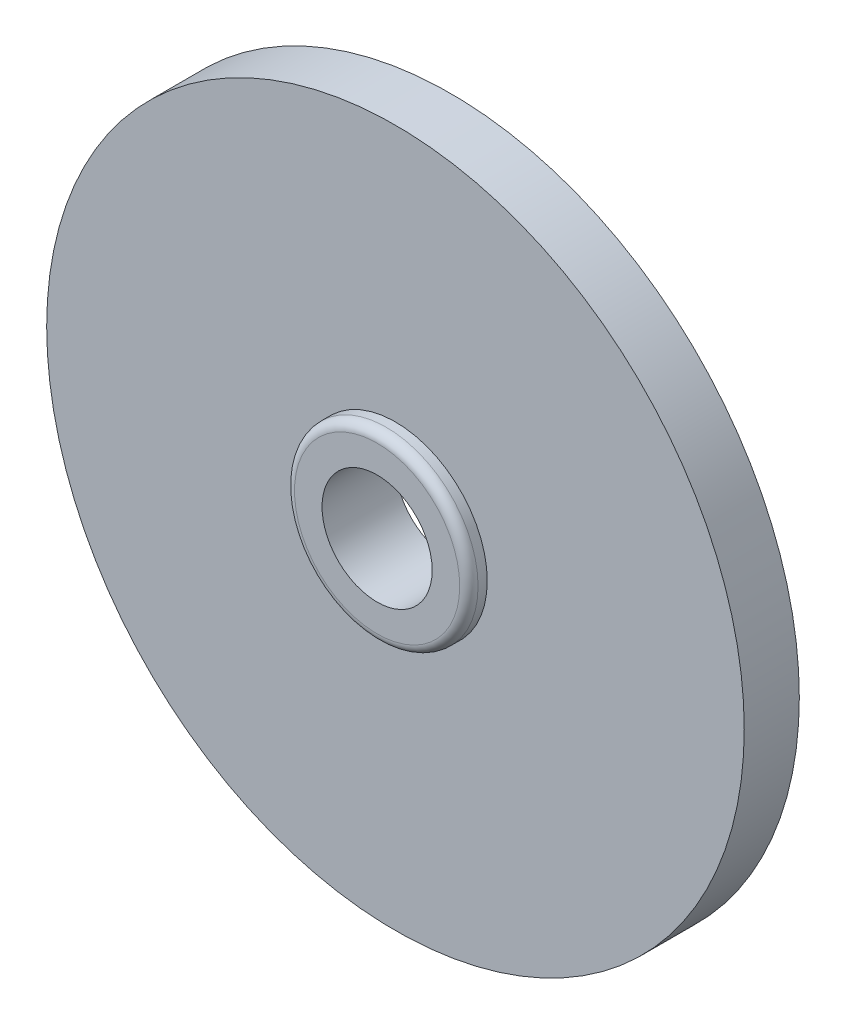
ISO-10303-21;
HEADER;
FILE_DESCRIPTION(('STEP AP214'),'2;1');
FILE_NAME('part.step','',(''),(''),'','','');
FILE_SCHEMA(('AUTOMOTIVE_DESIGN { 1 0 10303 214 1 1 1 1 }'));
ENDSEC;
DATA;
#1=APPLICATION_CONTEXT('core data for automotive mechanical design processes');
#2=APPLICATION_PROTOCOL_DEFINITION('international standard','automotive_design',2000,#1);
#3=PRODUCT_CONTEXT('',#1,'mechanical');
#4=PRODUCT('Part','Part','',(#3));
#5=PRODUCT_RELATED_PRODUCT_CATEGORY('part','',(#4));
#6=PRODUCT_DEFINITION_FORMATION('','',#4);
#7=PRODUCT_DEFINITION_CONTEXT('part definition',#1,'design');
#8=PRODUCT_DEFINITION('design','',#6,#7);
#9=PRODUCT_DEFINITION_SHAPE('','',#8);
#10=(LENGTH_UNIT() NAMED_UNIT(*) SI_UNIT(.MILLI.,.METRE.));
#11=(NAMED_UNIT(*) PLANE_ANGLE_UNIT() SI_UNIT($,.RADIAN.));
#12=(NAMED_UNIT(*) SI_UNIT($,.STERADIAN.) SOLID_ANGLE_UNIT());
#13=UNCERTAINTY_MEASURE_WITH_UNIT(LENGTH_MEASURE(1.E-05),#10,'distance_accuracy_value','');
#14=(GEOMETRIC_REPRESENTATION_CONTEXT(3) GLOBAL_UNCERTAINTY_ASSIGNED_CONTEXT((#13)) GLOBAL_UNIT_ASSIGNED_CONTEXT((#10,
#11,#12)) REPRESENTATION_CONTEXT('',''));
#15=CARTESIAN_POINT('',(0.,0.,0.));
#16=DIRECTION('',(0.,0.,1.));
#17=DIRECTION('',(1.,0.,0.));
#18=AXIS2_PLACEMENT_3D('',#15,#16,#17);
#19=CARTESIAN_POINT('',(0.,0.,1.5));
#20=DIRECTION('',(0.,0.,1.));
#21=DIRECTION('',(1.,0.,0.));
#22=AXIS2_PLACEMENT_3D('',#19,#20,#21);
#23=PLANE('',#22);
#24=CARTESIAN_POINT('',(0.,0.,1.5));
#25=DIRECTION('',(0.,0.,1.));
#26=DIRECTION('',(1.,0.,0.));
#27=AXIS2_PLACEMENT_3D('',#24,#25,#26);
#28=CIRCLE('',#27,9.5);
#29=CARTESIAN_POINT('',(9.5,0.,1.5));
#30=VERTEX_POINT('',#29);
#31=EDGE_CURVE('E42',#30,#30,#28,.T.);
#32=ORIENTED_EDGE('',*,*,#31,.T.);
#33=EDGE_LOOP('',(#32));
#34=FACE_BOUND('',#33,.T.);
#35=CARTESIAN_POINT('',(0.,0.,1.5));
#36=DIRECTION('',(0.,0.,1.));
#37=DIRECTION('',(1.,0.,0.));
#38=AXIS2_PLACEMENT_3D('',#35,#36,#37);
#39=CIRCLE('',#38,2.5);
#40=CARTESIAN_POINT('',(2.5,0.,1.5));
#41=VERTEX_POINT('',#40);
#42=EDGE_CURVE('E50',#41,#41,#39,.T.);
#43=ORIENTED_EDGE('',*,*,#42,.F.);
#44=EDGE_LOOP('',(#43));
#45=FACE_BOUND('',#44,.T.);
#46=ADVANCED_FACE('F31',(#34,#45),#23,.T.);
#47=CARTESIAN_POINT('',(0.,0.,1.5));
#48=DIRECTION('',(0.,0.,-1.));
#49=DIRECTION('',(-1.,0.,0.));
#50=AXIS2_PLACEMENT_3D('',#47,#48,#49);
#51=CYLINDRICAL_SURFACE('',#50,9.5);
#52=ORIENTED_EDGE('',*,*,#31,.F.);
#53=EDGE_LOOP('',(#52));
#54=FACE_BOUND('',#53,.T.);
#55=CARTESIAN_POINT('',(0.,0.,0.));
#56=DIRECTION('',(0.,0.,1.));
#57=DIRECTION('',(1.,0.,0.));
#58=AXIS2_PLACEMENT_3D('',#55,#56,#57);
#59=CIRCLE('',#58,9.5);
#60=CARTESIAN_POINT('',(9.5,0.,0.));
#61=VERTEX_POINT('',#60);
#62=EDGE_CURVE('E46',#61,#61,#59,.T.);
#63=ORIENTED_EDGE('',*,*,#62,.T.);
#64=EDGE_LOOP('',(#63));
#65=FACE_BOUND('',#64,.T.);
#66=ADVANCED_FACE('F76',(#54,#65),#51,.T.);
#67=CARTESIAN_POINT('',(0.,0.,0.));
#68=DIRECTION('',(0.,0.,1.));
#69=DIRECTION('',(1.,0.,0.));
#70=AXIS2_PLACEMENT_3D('',#67,#68,#69);
#71=PLANE('',#70);
#72=CARTESIAN_POINT('',(0.,0.,0.));
#73=DIRECTION('',(0.,0.,1.));
#74=DIRECTION('',(1.,0.,0.));
#75=AXIS2_PLACEMENT_3D('',#72,#73,#74);
#76=CIRCLE('',#75,1.5);
#77=CARTESIAN_POINT('',(1.5,0.,0.));
#78=VERTEX_POINT('',#77);
#79=EDGE_CURVE('E54',#78,#78,#76,.T.);
#80=ORIENTED_EDGE('',*,*,#79,.T.);
#81=EDGE_LOOP('',(#80));
#82=FACE_BOUND('',#81,.T.);
#83=ORIENTED_EDGE('',*,*,#62,.F.);
#84=EDGE_LOOP('',(#83));
#85=FACE_BOUND('',#84,.T.);
#86=ADVANCED_FACE('F73',(#82,#85),#71,.F.);
#87=CARTESIAN_POINT('',(0.,0.,2.));
#88=DIRECTION('',(0.,0.,-1.));
#89=DIRECTION('',(-1.,0.,0.));
#90=AXIS2_PLACEMENT_3D('',#87,#88,#89);
#91=CYLINDRICAL_SURFACE('',#90,2.5);
#92=CARTESIAN_POINT('',(0.,0.,1.75));
#93=DIRECTION('',(0.,0.,1.));
#94=DIRECTION('',(1.,0.,0.));
#95=AXIS2_PLACEMENT_3D('',#92,#93,#94);
#96=CIRCLE('',#95,2.5);
#97=CARTESIAN_POINT('',(2.5,0.,1.75));
#98=VERTEX_POINT('',#97);
#99=EDGE_CURVE('E10',#98,#98,#96,.F.);
#100=ORIENTED_EDGE('',*,*,#99,.T.);
#101=EDGE_LOOP('',(#100));
#102=FACE_BOUND('',#101,.T.);
#103=ORIENTED_EDGE('',*,*,#42,.T.);
#104=EDGE_LOOP('',(#103));
#105=FACE_BOUND('',#104,.T.);
#106=ADVANCED_FACE('F66',(#102,#105),#91,.T.);
#107=CARTESIAN_POINT('',(0.,0.,2.));
#108=DIRECTION('',(0.,0.,1.));
#109=DIRECTION('',(1.,0.,0.));
#110=AXIS2_PLACEMENT_3D('',#107,#108,#109);
#111=PLANE('',#110);
#112=CARTESIAN_POINT('',(0.,0.,2.));
#113=DIRECTION('',(0.,0.,1.));
#114=DIRECTION('',(1.,0.,0.));
#115=AXIS2_PLACEMENT_3D('',#112,#113,#114);
#116=CIRCLE('',#115,2.25);
#117=CARTESIAN_POINT('',(2.25,0.,2.));
#118=VERTEX_POINT('',#117);
#119=EDGE_CURVE('E38',#118,#118,#116,.T.);
#120=ORIENTED_EDGE('',*,*,#119,.T.);
#121=EDGE_LOOP('',(#120));
#122=FACE_BOUND('',#121,.T.);
#123=CARTESIAN_POINT('',(0.,0.,2.));
#124=DIRECTION('',(0.,0.,1.));
#125=DIRECTION('',(1.,0.,0.));
#126=AXIS2_PLACEMENT_3D('',#123,#124,#125);
#127=CIRCLE('',#126,1.5);
#128=CARTESIAN_POINT('',(1.5,0.,2.));
#129=VERTEX_POINT('',#128);
#130=EDGE_CURVE('E57',#129,#129,#127,.T.);
#131=ORIENTED_EDGE('',*,*,#130,.F.);
#132=EDGE_LOOP('',(#131));
#133=FACE_BOUND('',#132,.T.);
#134=ADVANCED_FACE('F64',(#122,#133),#111,.T.);
#135=CARTESIAN_POINT('',(0.,0.,-1.58196993154205));
#136=DIRECTION('',(0.,0.,1.));
#137=DIRECTION('',(1.,0.,0.));
#138=AXIS2_PLACEMENT_3D('',#135,#136,#137);
#139=CYLINDRICAL_SURFACE('',#138,1.5);
#140=ORIENTED_EDGE('',*,*,#130,.T.);
#141=EDGE_LOOP('',(#140));
#142=FACE_BOUND('',#141,.T.);
#143=ORIENTED_EDGE('',*,*,#79,.F.);
#144=EDGE_LOOP('',(#143));
#145=FACE_BOUND('',#144,.T.);
#146=ADVANCED_FACE('F61',(#142,#145),#139,.F.);
#147=CARTESIAN_POINT('',(0.,0.,1.75));
#148=DIRECTION('',(0.,0.,1.));
#149=DIRECTION('',(1.,0.,0.));
#150=AXIS2_PLACEMENT_3D('',#147,#148,#149);
#151=TOROIDAL_SURFACE('',#150,2.25,0.25);
#152=ORIENTED_EDGE('',*,*,#99,.F.);
#153=EDGE_LOOP('',(#152));
#154=FACE_BOUND('',#153,.T.);
#155=ORIENTED_EDGE('',*,*,#119,.F.);
#156=EDGE_LOOP('',(#155));
#157=FACE_BOUND('',#156,.T.);
#158=ADVANCED_FACE('F33',(#154,#157),#151,.T.);
#159=CLOSED_SHELL('',(#46,#66,#86,#106,#134,#146,#158));
#160=MANIFOLD_SOLID_BREP('B2',#159);
#161=ADVANCED_BREP_SHAPE_REPRESENTATION('',(#18,#160),#14);
#162=SHAPE_DEFINITION_REPRESENTATION(#9,#161);
ENDSEC;
END-ISO-10303-21;
